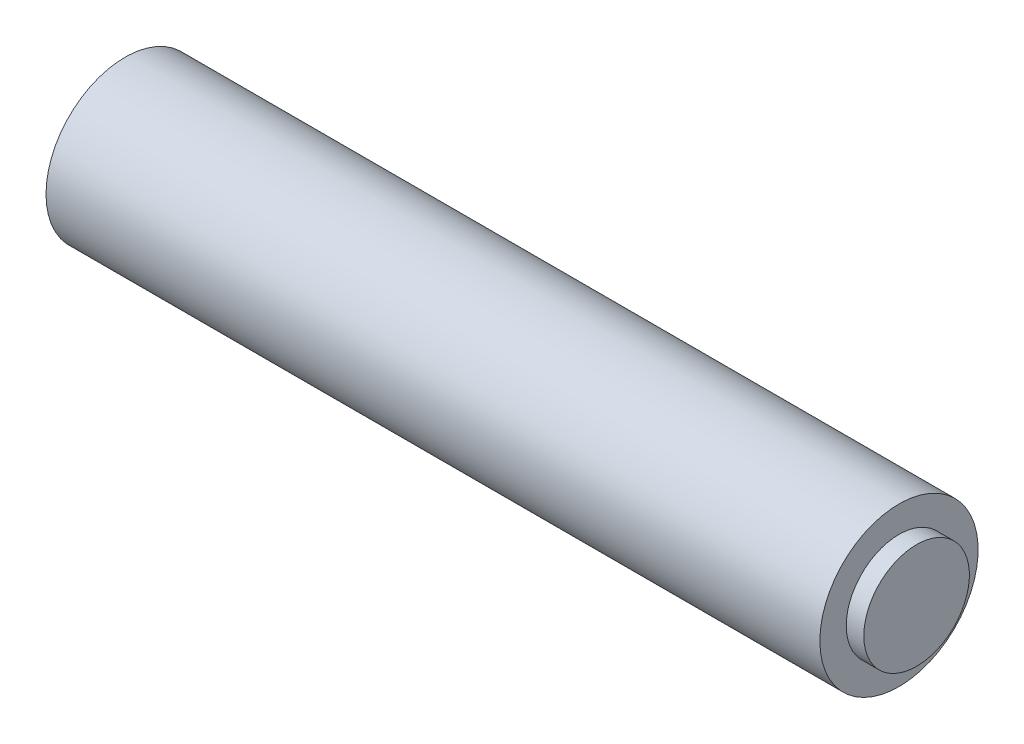
ISO-10303-21;
HEADER;
FILE_DESCRIPTION(('STEP AP214'),'2;1');
FILE_NAME('part.step','',(''),(''),'','','');
FILE_SCHEMA(('AUTOMOTIVE_DESIGN { 1 0 10303 214 1 1 1 1 }'));
ENDSEC;
DATA;
#1=APPLICATION_CONTEXT('core data for automotive mechanical design processes');
#2=APPLICATION_PROTOCOL_DEFINITION('international standard','automotive_design',2000,#1);
#3=PRODUCT_CONTEXT('',#1,'mechanical');
#4=PRODUCT('Part','Part','',(#3));
#5=PRODUCT_RELATED_PRODUCT_CATEGORY('part','',(#4));
#6=PRODUCT_DEFINITION_FORMATION('','',#4);
#7=PRODUCT_DEFINITION_CONTEXT('part definition',#1,'design');
#8=PRODUCT_DEFINITION('design','',#6,#7);
#9=PRODUCT_DEFINITION_SHAPE('','',#8);
#10=(LENGTH_UNIT() NAMED_UNIT(*) SI_UNIT(.MILLI.,.METRE.));
#11=(NAMED_UNIT(*) PLANE_ANGLE_UNIT() SI_UNIT($,.RADIAN.));
#12=(NAMED_UNIT(*) SI_UNIT($,.STERADIAN.) SOLID_ANGLE_UNIT());
#13=UNCERTAINTY_MEASURE_WITH_UNIT(LENGTH_MEASURE(1.E-05),#10,'distance_accuracy_value','');
#14=(GEOMETRIC_REPRESENTATION_CONTEXT(3) GLOBAL_UNCERTAINTY_ASSIGNED_CONTEXT((#13)) GLOBAL_UNIT_ASSIGNED_CONTEXT((#10,
#11,#12)) REPRESENTATION_CONTEXT('',''));
#15=CARTESIAN_POINT('',(0.,0.,0.));
#16=DIRECTION('',(0.,0.,1.));
#17=DIRECTION('',(1.,0.,0.));
#18=AXIS2_PLACEMENT_3D('',#15,#16,#17);
#19=CARTESIAN_POINT('',(-35.5461643431283,0.,0.));
#20=DIRECTION('',(1.,0.,0.));
#21=DIRECTION('',(0.,0.,-1.));
#22=AXIS2_PLACEMENT_3D('',#19,#20,#21);
#23=PLANE('',#22);
#24=CARTESIAN_POINT('',(-35.5461643431283,0.,0.));
#25=DIRECTION('',(-1.,0.,0.));
#26=DIRECTION('',(0.,0.,1.));
#27=AXIS2_PLACEMENT_3D('',#24,#25,#26);
#28=CIRCLE('',#27,3.);
#29=CARTESIAN_POINT('',(-35.5461643431283,0.,3.));
#30=VERTEX_POINT('',#29);
#31=EDGE_CURVE('E10',#30,#30,#28,.T.);
#32=ORIENTED_EDGE('',*,*,#31,.T.);
#33=EDGE_LOOP('',(#32));
#34=FACE_BOUND('',#33,.T.);
#35=ADVANCED_FACE('F30',(#34),#23,.F.);
#36=CARTESIAN_POINT('',(-60.965401978291,0.,0.));
#37=DIRECTION('',(-1.,0.,0.));
#38=DIRECTION('',(0.,0.,1.));
#39=AXIS2_PLACEMENT_3D('',#36,#37,#38);
#40=CYLINDRICAL_SURFACE('',#39,3.);
#41=ORIENTED_EDGE('',*,*,#31,.F.);
#42=EDGE_LOOP('',(#41));
#43=FACE_BOUND('',#42,.T.);
#44=CARTESIAN_POINT('',(-34.5461643431283,0.,0.));
#45=DIRECTION('',(-1.,0.,0.));
#46=DIRECTION('',(0.,0.,1.));
#47=AXIS2_PLACEMENT_3D('',#44,#45,#46);
#48=CIRCLE('',#47,3.);
#49=CARTESIAN_POINT('',(-34.5461643431283,0.,3.));
#50=VERTEX_POINT('',#49);
#51=EDGE_CURVE('E36',#50,#50,#48,.T.);
#52=ORIENTED_EDGE('',*,*,#51,.T.);
#53=EDGE_LOOP('',(#52));
#54=FACE_BOUND('',#53,.T.);
#55=ADVANCED_FACE('F68',(#43,#54),#40,.T.);
#56=CARTESIAN_POINT('',(-34.5461643431283,3.,0.));
#57=DIRECTION('',(1.,0.,0.));
#58=DIRECTION('',(0.,0.,-1.));
#59=AXIS2_PLACEMENT_3D('',#56,#57,#58);
#60=PLANE('',#59);
#61=ORIENTED_EDGE('',*,*,#51,.F.);
#62=EDGE_LOOP('',(#61));
#63=FACE_BOUND('',#62,.T.);
#64=CARTESIAN_POINT('',(-34.5461643431283,0.,0.));
#65=DIRECTION('',(-1.,0.,0.));
#66=DIRECTION('',(0.,0.,1.));
#67=AXIS2_PLACEMENT_3D('',#64,#65,#66);
#68=CIRCLE('',#67,4.5);
#69=CARTESIAN_POINT('',(-34.5461643431283,0.,4.5));
#70=VERTEX_POINT('',#69);
#71=EDGE_CURVE('E40',#70,#70,#68,.T.);
#72=ORIENTED_EDGE('',*,*,#71,.T.);
#73=EDGE_LOOP('',(#72));
#74=FACE_BOUND('',#73,.T.);
#75=ADVANCED_FACE('F72',(#63,#74),#60,.F.);
#76=CARTESIAN_POINT('',(-60.965401978291,0.,0.));
#77=DIRECTION('',(-1.,0.,0.));
#78=DIRECTION('',(0.,0.,1.));
#79=AXIS2_PLACEMENT_3D('',#76,#77,#78);
#80=CYLINDRICAL_SURFACE('',#79,4.5);
#81=ORIENTED_EDGE('',*,*,#71,.F.);
#82=EDGE_LOOP('',(#81));
#83=FACE_BOUND('',#82,.T.);
#84=CARTESIAN_POINT('',(9.45383565687175,0.,0.));
#85=DIRECTION('',(-1.,0.,0.));
#86=DIRECTION('',(0.,0.,1.));
#87=AXIS2_PLACEMENT_3D('',#84,#85,#86);
#88=CIRCLE('',#87,4.5);
#89=CARTESIAN_POINT('',(9.45383565687175,0.,4.5));
#90=VERTEX_POINT('',#89);
#91=EDGE_CURVE('E44',#90,#90,#88,.T.);
#92=ORIENTED_EDGE('',*,*,#91,.T.);
#93=EDGE_LOOP('',(#92));
#94=FACE_BOUND('',#93,.T.);
#95=ADVANCED_FACE('F77',(#83,#94),#80,.T.);
#96=CARTESIAN_POINT('',(9.45383565687175,4.5,0.));
#97=DIRECTION('',(-1.,0.,0.));
#98=DIRECTION('',(0.,0.,1.));
#99=AXIS2_PLACEMENT_3D('',#96,#97,#98);
#100=PLANE('',#99);
#101=ORIENTED_EDGE('',*,*,#91,.F.);
#102=EDGE_LOOP('',(#101));
#103=FACE_BOUND('',#102,.T.);
#104=CARTESIAN_POINT('',(9.45383565687175,0.,0.));
#105=DIRECTION('',(-1.,0.,0.));
#106=DIRECTION('',(0.,0.,1.));
#107=AXIS2_PLACEMENT_3D('',#104,#105,#106);
#108=CIRCLE('',#107,3.);
#109=CARTESIAN_POINT('',(9.45383565687175,0.,3.));
#110=VERTEX_POINT('',#109);
#111=EDGE_CURVE('E49',#110,#110,#108,.T.);
#112=ORIENTED_EDGE('',*,*,#111,.T.);
#113=EDGE_LOOP('',(#112));
#114=FACE_BOUND('',#113,.T.);
#115=ADVANCED_FACE('F64',(#103,#114),#100,.F.);
#116=CARTESIAN_POINT('',(-60.965401978291,0.,0.));
#117=DIRECTION('',(-1.,0.,0.));
#118=DIRECTION('',(0.,0.,1.));
#119=AXIS2_PLACEMENT_3D('',#116,#117,#118);
#120=CYLINDRICAL_SURFACE('',#119,3.);
#121=ORIENTED_EDGE('',*,*,#111,.F.);
#122=EDGE_LOOP('',(#121));
#123=FACE_BOUND('',#122,.T.);
#124=CARTESIAN_POINT('',(10.4538356568717,0.,0.));
#125=DIRECTION('',(-1.,0.,0.));
#126=DIRECTION('',(0.,0.,1.));
#127=AXIS2_PLACEMENT_3D('',#124,#125,#126);
#128=CIRCLE('',#127,3.);
#129=CARTESIAN_POINT('',(10.4538356568717,0.,3.));
#130=VERTEX_POINT('',#129);
#131=EDGE_CURVE('E52',#130,#130,#128,.T.);
#132=ORIENTED_EDGE('',*,*,#131,.T.);
#133=EDGE_LOOP('',(#132));
#134=FACE_BOUND('',#133,.T.);
#135=ADVANCED_FACE('F56',(#123,#134),#120,.T.);
#136=CARTESIAN_POINT('',(10.4538356568717,3.,0.));
#137=DIRECTION('',(-1.,0.,0.));
#138=DIRECTION('',(0.,0.,1.));
#139=AXIS2_PLACEMENT_3D('',#136,#137,#138);
#140=PLANE('',#139);
#141=ORIENTED_EDGE('',*,*,#131,.F.);
#142=EDGE_LOOP('',(#141));
#143=FACE_BOUND('',#142,.T.);
#144=ADVANCED_FACE('F58',(#143),#140,.F.);
#145=CLOSED_SHELL('',(#35,#55,#75,#95,#115,#135,#144));
#146=MANIFOLD_SOLID_BREP('B2',#145);
#147=ADVANCED_BREP_SHAPE_REPRESENTATION('',(#18,#146),#14);
#148=SHAPE_DEFINITION_REPRESENTATION(#9,#147);
ENDSEC;
END-ISO-10303-21;
